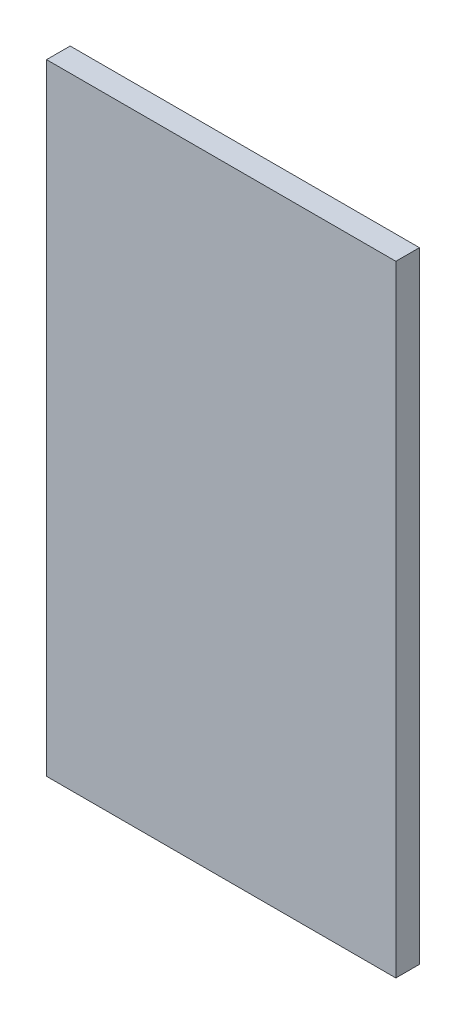
ISO-10303-21;
HEADER;
FILE_DESCRIPTION(('STEP AP214'),'2;1');
FILE_NAME('part.step','',(''),(''),'','','');
FILE_SCHEMA(('AUTOMOTIVE_DESIGN { 1 0 10303 214 1 1 1 1 }'));
ENDSEC;
DATA;
#1=APPLICATION_CONTEXT('core data for automotive mechanical design processes');
#2=APPLICATION_PROTOCOL_DEFINITION('international standard','automotive_design',2000,#1);
#3=PRODUCT_CONTEXT('',#1,'mechanical');
#4=PRODUCT('Part','Part','',(#3));
#5=PRODUCT_RELATED_PRODUCT_CATEGORY('part','',(#4));
#6=PRODUCT_DEFINITION_FORMATION('','',#4);
#7=PRODUCT_DEFINITION_CONTEXT('part definition',#1,'design');
#8=PRODUCT_DEFINITION('design','',#6,#7);
#9=PRODUCT_DEFINITION_SHAPE('','',#8);
#10=(LENGTH_UNIT() NAMED_UNIT(*) SI_UNIT(.MILLI.,.METRE.));
#11=(NAMED_UNIT(*) PLANE_ANGLE_UNIT() SI_UNIT($,.RADIAN.));
#12=(NAMED_UNIT(*) SI_UNIT($,.STERADIAN.) SOLID_ANGLE_UNIT());
#13=UNCERTAINTY_MEASURE_WITH_UNIT(LENGTH_MEASURE(1.E-05),#10,'distance_accuracy_value','');
#14=(GEOMETRIC_REPRESENTATION_CONTEXT(3) GLOBAL_UNCERTAINTY_ASSIGNED_CONTEXT((#13)) GLOBAL_UNIT_ASSIGNED_CONTEXT((#10,
#11,#12)) REPRESENTATION_CONTEXT('',''));
#15=CARTESIAN_POINT('',(0.,0.,0.));
#16=DIRECTION('',(0.,0.,1.));
#17=DIRECTION('',(1.,0.,0.));
#18=AXIS2_PLACEMENT_3D('',#15,#16,#17);
#19=CARTESIAN_POINT('',(-5.815,-1.315,0.));
#20=DIRECTION('',(1.,0.,0.));
#21=DIRECTION('',(0.,0.,1.));
#22=AXIS2_PLACEMENT_3D('',#19,#20,#21);
#23=PLANE('',#22);
#24=DIRECTION('',(0.,1.,0.));
#25=VECTOR('',#24,1.);
#26=CARTESIAN_POINT('',(-5.815,-1.315,0.1));
#27=LINE('',#26,#25);
#28=CARTESIAN_POINT('',(-5.815,-1.315,0.1));
#29=VERTEX_POINT('',#28);
#30=CARTESIAN_POINT('',(-5.815,1.315,0.1));
#31=VERTEX_POINT('',#30);
#32=EDGE_CURVE('E11',#29,#31,#27,.T.);
#33=ORIENTED_EDGE('',*,*,#32,.T.);
#34=DIRECTION('',(0.,0.,1.));
#35=VECTOR('',#34,1.);
#36=CARTESIAN_POINT('',(-5.815,1.315,0.));
#37=LINE('',#36,#35);
#38=CARTESIAN_POINT('',(-5.815,1.315,0.));
#39=VERTEX_POINT('',#38);
#40=EDGE_CURVE('E23',#39,#31,#37,.T.);
#41=ORIENTED_EDGE('',*,*,#40,.F.);
#42=DIRECTION('',(0.,1.,0.));
#43=VECTOR('',#42,1.);
#44=CARTESIAN_POINT('',(-5.815,-1.315,0.));
#45=LINE('',#44,#43);
#46=CARTESIAN_POINT('',(-5.815,-1.315,0.));
#47=VERTEX_POINT('',#46);
#48=EDGE_CURVE('E85',#47,#39,#45,.T.);
#49=ORIENTED_EDGE('',*,*,#48,.F.);
#50=DIRECTION('',(0.,0.,1.));
#51=VECTOR('',#50,1.);
#52=CARTESIAN_POINT('',(-5.815,-1.315,0.));
#53=LINE('',#52,#51);
#54=EDGE_CURVE('E35',#47,#29,#53,.T.);
#55=ORIENTED_EDGE('',*,*,#54,.T.);
#56=EDGE_LOOP('',(#33,#41,#49,#55));
#57=FACE_BOUND('',#56,.T.);
#58=ADVANCED_FACE('F16',(#57),#23,.F.);
#59=CARTESIAN_POINT('',(-4.335,-1.315,0.));
#60=DIRECTION('',(1.,0.,0.));
#61=DIRECTION('',(0.,0.,1.));
#62=AXIS2_PLACEMENT_3D('',#59,#60,#61);
#63=PLANE('',#62);
#64=DIRECTION('',(0.,0.,1.));
#65=VECTOR('',#64,1.);
#66=CARTESIAN_POINT('',(-4.335,-1.315,0.));
#67=LINE('',#66,#65);
#68=CARTESIAN_POINT('',(-4.335,-1.315,0.));
#69=VERTEX_POINT('',#68);
#70=CARTESIAN_POINT('',(-4.335,-1.315,0.1));
#71=VERTEX_POINT('',#70);
#72=EDGE_CURVE('E82',#69,#71,#67,.T.);
#73=ORIENTED_EDGE('',*,*,#72,.F.);
#74=DIRECTION('',(0.,1.,0.));
#75=VECTOR('',#74,1.);
#76=CARTESIAN_POINT('',(-4.335,-1.315,0.));
#77=LINE('',#76,#75);
#78=CARTESIAN_POINT('',(-4.335,1.315,0.));
#79=VERTEX_POINT('',#78);
#80=EDGE_CURVE('E62',#69,#79,#77,.T.);
#81=ORIENTED_EDGE('',*,*,#80,.T.);
#82=DIRECTION('',(0.,0.,1.));
#83=VECTOR('',#82,1.);
#84=CARTESIAN_POINT('',(-4.335,1.315,0.));
#85=LINE('',#84,#83);
#86=CARTESIAN_POINT('',(-4.335,1.315,0.1));
#87=VERTEX_POINT('',#86);
#88=EDGE_CURVE('E56',#79,#87,#85,.T.);
#89=ORIENTED_EDGE('',*,*,#88,.T.);
#90=DIRECTION('',(0.,1.,0.));
#91=VECTOR('',#90,1.);
#92=CARTESIAN_POINT('',(-4.335,-1.315,0.1));
#93=LINE('',#92,#91);
#94=EDGE_CURVE('E59',#71,#87,#93,.T.);
#95=ORIENTED_EDGE('',*,*,#94,.F.);
#96=EDGE_LOOP('',(#73,#81,#89,#95));
#97=FACE_BOUND('',#96,.T.);
#98=ADVANCED_FACE('F58',(#97),#63,.T.);
#99=CARTESIAN_POINT('',(-5.815,-1.315,0.));
#100=DIRECTION('',(0.,1.,0.));
#101=DIRECTION('',(0.,0.,1.));
#102=AXIS2_PLACEMENT_3D('',#99,#100,#101);
#103=PLANE('',#102);
#104=ORIENTED_EDGE('',*,*,#72,.T.);
#105=DIRECTION('',(1.,0.,0.));
#106=VECTOR('',#105,1.);
#107=CARTESIAN_POINT('',(-5.815,-1.315,0.1));
#108=LINE('',#107,#106);
#109=EDGE_CURVE('E70',#29,#71,#108,.T.);
#110=ORIENTED_EDGE('',*,*,#109,.F.);
#111=ORIENTED_EDGE('',*,*,#54,.F.);
#112=DIRECTION('',(1.,0.,0.));
#113=VECTOR('',#112,1.);
#114=CARTESIAN_POINT('',(-5.815,-1.315,0.));
#115=LINE('',#114,#113);
#116=EDGE_CURVE('E75',#47,#69,#115,.T.);
#117=ORIENTED_EDGE('',*,*,#116,.T.);
#118=EDGE_LOOP('',(#104,#110,#111,#117));
#119=FACE_BOUND('',#118,.T.);
#120=ADVANCED_FACE('F90',(#119),#103,.F.);
#121=CARTESIAN_POINT('',(-5.815,1.315,0.));
#122=DIRECTION('',(0.,1.,0.));
#123=DIRECTION('',(0.,0.,1.));
#124=AXIS2_PLACEMENT_3D('',#121,#122,#123);
#125=PLANE('',#124);
#126=DIRECTION('',(1.,0.,0.));
#127=VECTOR('',#126,1.);
#128=CARTESIAN_POINT('',(-5.815,1.315,0.));
#129=LINE('',#128,#127);
#130=EDGE_CURVE('E73',#39,#79,#129,.T.);
#131=ORIENTED_EDGE('',*,*,#130,.F.);
#132=ORIENTED_EDGE('',*,*,#40,.T.);
#133=DIRECTION('',(1.,0.,0.));
#134=VECTOR('',#133,1.);
#135=CARTESIAN_POINT('',(-5.815,1.315,0.1));
#136=LINE('',#135,#134);
#137=EDGE_CURVE('E68',#31,#87,#136,.T.);
#138=ORIENTED_EDGE('',*,*,#137,.T.);
#139=ORIENTED_EDGE('',*,*,#88,.F.);
#140=EDGE_LOOP('',(#131,#132,#138,#139));
#141=FACE_BOUND('',#140,.T.);
#142=ADVANCED_FACE('F72',(#141),#125,.T.);
#143=CARTESIAN_POINT('',(-5.815,-1.315,0.));
#144=DIRECTION('',(0.,0.,1.));
#145=DIRECTION('',(1.,0.,0.));
#146=AXIS2_PLACEMENT_3D('',#143,#144,#145);
#147=PLANE('',#146);
#148=ORIENTED_EDGE('',*,*,#130,.T.);
#149=ORIENTED_EDGE('',*,*,#80,.F.);
#150=ORIENTED_EDGE('',*,*,#116,.F.);
#151=ORIENTED_EDGE('',*,*,#48,.T.);
#152=EDGE_LOOP('',(#148,#149,#150,#151));
#153=FACE_BOUND('',#152,.T.);
#154=ADVANCED_FACE('F88',(#153),#147,.F.);
#155=CARTESIAN_POINT('',(-5.815,-1.315,0.1));
#156=DIRECTION('',(0.,0.,1.));
#157=DIRECTION('',(1.,0.,0.));
#158=AXIS2_PLACEMENT_3D('',#155,#156,#157);
#159=PLANE('',#158);
#160=ORIENTED_EDGE('',*,*,#32,.F.);
#161=ORIENTED_EDGE('',*,*,#109,.T.);
#162=ORIENTED_EDGE('',*,*,#94,.T.);
#163=ORIENTED_EDGE('',*,*,#137,.F.);
#164=EDGE_LOOP('',(#160,#161,#162,#163));
#165=FACE_BOUND('',#164,.T.);
#166=ADVANCED_FACE('F67',(#165),#159,.T.);
#167=CLOSED_SHELL('',(#58,#98,#120,#142,#154,#166));
#168=MANIFOLD_SOLID_BREP('B1',#167);
#169=ADVANCED_BREP_SHAPE_REPRESENTATION('',(#18,#168),#14);
#170=SHAPE_DEFINITION_REPRESENTATION(#9,#169);
ENDSEC;
END-ISO-10303-21;
